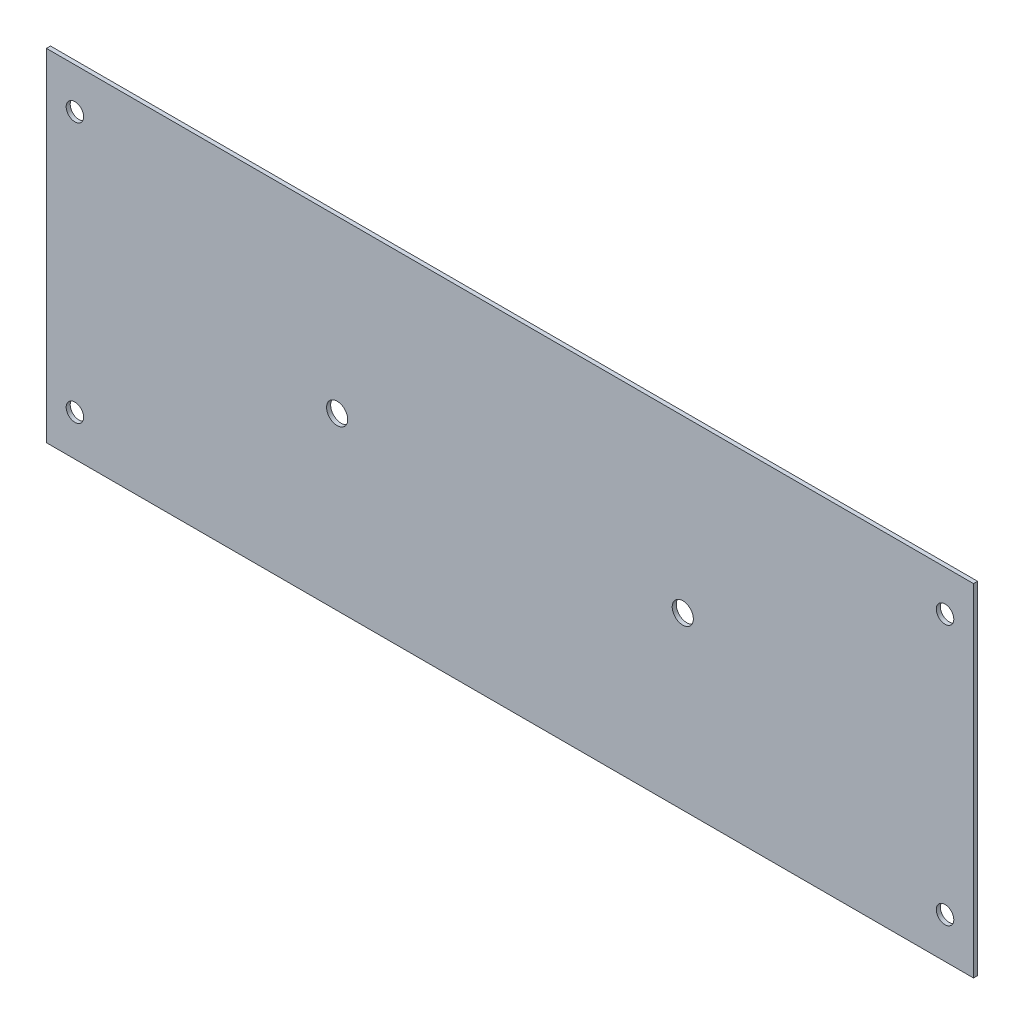
ISO-10303-21;
HEADER;
FILE_DESCRIPTION(('STEP AP214'),'2;1');
FILE_NAME('part.step','',(''),(''),'','','');
FILE_SCHEMA(('AUTOMOTIVE_DESIGN { 1 0 10303 214 1 1 1 1 }'));
ENDSEC;
DATA;
#1=APPLICATION_CONTEXT('core data for automotive mechanical design processes');
#2=APPLICATION_PROTOCOL_DEFINITION('international standard','automotive_design',2000,#1);
#3=PRODUCT_CONTEXT('',#1,'mechanical');
#4=PRODUCT('Part','Part','',(#3));
#5=PRODUCT_RELATED_PRODUCT_CATEGORY('part','',(#4));
#6=PRODUCT_DEFINITION_FORMATION('','',#4);
#7=PRODUCT_DEFINITION_CONTEXT('part definition',#1,'design');
#8=PRODUCT_DEFINITION('design','',#6,#7);
#9=PRODUCT_DEFINITION_SHAPE('','',#8);
#10=(LENGTH_UNIT() NAMED_UNIT(*) SI_UNIT(.MILLI.,.METRE.));
#11=(NAMED_UNIT(*) PLANE_ANGLE_UNIT() SI_UNIT($,.RADIAN.));
#12=(NAMED_UNIT(*) SI_UNIT($,.STERADIAN.) SOLID_ANGLE_UNIT());
#13=UNCERTAINTY_MEASURE_WITH_UNIT(LENGTH_MEASURE(1.E-05),#10,'distance_accuracy_value','');
#14=(GEOMETRIC_REPRESENTATION_CONTEXT(3) GLOBAL_UNCERTAINTY_ASSIGNED_CONTEXT((#13)) GLOBAL_UNIT_ASSIGNED_CONTEXT((#10,
#11,#12)) REPRESENTATION_CONTEXT('',''));
#15=CARTESIAN_POINT('',(0.,0.,0.));
#16=DIRECTION('',(0.,0.,1.));
#17=DIRECTION('',(1.,0.,0.));
#18=AXIS2_PLACEMENT_3D('',#15,#16,#17);
#19=CARTESIAN_POINT('',(-114.,-42.,1.));
#20=DIRECTION('',(0.,0.,-1.));
#21=DIRECTION('',(-1.,0.,0.));
#22=AXIS2_PLACEMENT_3D('',#19,#20,#21);
#23=PLANE('',#22);
#24=CARTESIAN_POINT('',(-107.,-32.,1.));
#25=DIRECTION('',(0.,0.,1.));
#26=DIRECTION('',(1.,0.,0.));
#27=AXIS2_PLACEMENT_3D('',#24,#25,#26);
#28=CIRCLE('',#27,2.15);
#29=CARTESIAN_POINT('',(-104.85,-32.,1.));
#30=VERTEX_POINT('',#29);
#31=EDGE_CURVE('E131',#30,#30,#28,.T.);
#32=ORIENTED_EDGE('',*,*,#31,.F.);
#33=EDGE_LOOP('',(#32));
#34=FACE_BOUND('',#33,.T.);
#35=CARTESIAN_POINT('',(107.,32.,1.));
#36=DIRECTION('',(0.,0.,1.));
#37=DIRECTION('',(1.,0.,0.));
#38=AXIS2_PLACEMENT_3D('',#35,#36,#37);
#39=CIRCLE('',#38,2.15);
#40=CARTESIAN_POINT('',(109.15,32.,1.));
#41=VERTEX_POINT('',#40);
#42=EDGE_CURVE('E119',#41,#41,#39,.T.);
#43=ORIENTED_EDGE('',*,*,#42,.F.);
#44=EDGE_LOOP('',(#43));
#45=FACE_BOUND('',#44,.T.);
#46=CARTESIAN_POINT('',(-42.5,0.,1.));
#47=DIRECTION('',(0.,0.,1.));
#48=DIRECTION('',(1.,0.,0.));
#49=AXIS2_PLACEMENT_3D('',#46,#47,#48);
#50=CIRCLE('',#49,2.6);
#51=CARTESIAN_POINT('',(-39.9,0.,1.));
#52=VERTEX_POINT('',#51);
#53=EDGE_CURVE('E98',#52,#52,#50,.T.);
#54=ORIENTED_EDGE('',*,*,#53,.F.);
#55=EDGE_LOOP('',(#54));
#56=FACE_BOUND('',#55,.T.);
#57=DIRECTION('',(0.,-1.,0.));
#58=VECTOR('',#57,1.);
#59=CARTESIAN_POINT('',(-114.,-42.,1.));
#60=LINE('',#59,#58);
#61=CARTESIAN_POINT('',(-114.,42.,1.));
#62=VERTEX_POINT('',#61);
#63=CARTESIAN_POINT('',(-114.,-42.,1.));
#64=VERTEX_POINT('',#63);
#65=EDGE_CURVE('E83',#62,#64,#60,.T.);
#66=ORIENTED_EDGE('',*,*,#65,.T.);
#67=DIRECTION('',(1.,0.,0.));
#68=VECTOR('',#67,1.);
#69=CARTESIAN_POINT('',(-114.,-42.,1.));
#70=LINE('',#69,#68);
#71=CARTESIAN_POINT('',(114.,-42.,1.));
#72=VERTEX_POINT('',#71);
#73=EDGE_CURVE('E78',#64,#72,#70,.T.);
#74=ORIENTED_EDGE('',*,*,#73,.T.);
#75=DIRECTION('',(0.,1.,0.));
#76=VECTOR('',#75,1.);
#77=CARTESIAN_POINT('',(114.,-42.,1.));
#78=LINE('',#77,#76);
#79=CARTESIAN_POINT('',(114.,42.,1.));
#80=VERTEX_POINT('',#79);
#81=EDGE_CURVE('E81',#72,#80,#78,.T.);
#82=ORIENTED_EDGE('',*,*,#81,.T.);
#83=DIRECTION('',(-1.,0.,0.));
#84=VECTOR('',#83,1.);
#85=CARTESIAN_POINT('',(-114.,42.,1.));
#86=LINE('',#85,#84);
#87=EDGE_CURVE('E48',#80,#62,#86,.T.);
#88=ORIENTED_EDGE('',*,*,#87,.T.);
#89=EDGE_LOOP('',(#66,#74,#82,#88));
#90=FACE_BOUND('',#89,.T.);
#91=CARTESIAN_POINT('',(42.5,0.,1.));
#92=DIRECTION('',(0.,0.,1.));
#93=DIRECTION('',(1.,0.,0.));
#94=AXIS2_PLACEMENT_3D('',#91,#92,#93);
#95=CIRCLE('',#94,2.6);
#96=CARTESIAN_POINT('',(45.1,0.,1.));
#97=VERTEX_POINT('',#96);
#98=EDGE_CURVE('E113',#97,#97,#95,.T.);
#99=ORIENTED_EDGE('',*,*,#98,.F.);
#100=EDGE_LOOP('',(#99));
#101=FACE_BOUND('',#100,.T.);
#102=CARTESIAN_POINT('',(-107.,32.,1.));
#103=DIRECTION('',(0.,0.,1.));
#104=DIRECTION('',(-1.,0.,0.));
#105=AXIS2_PLACEMENT_3D('',#102,#103,#104);
#106=CIRCLE('',#105,2.15);
#107=CARTESIAN_POINT('',(-109.15,32.,1.));
#108=VERTEX_POINT('',#107);
#109=EDGE_CURVE('E125',#108,#108,#106,.T.);
#110=ORIENTED_EDGE('',*,*,#109,.F.);
#111=EDGE_LOOP('',(#110));
#112=FACE_BOUND('',#111,.T.);
#113=CARTESIAN_POINT('',(107.,-32.,1.));
#114=DIRECTION('',(0.,0.,1.));
#115=DIRECTION('',(-1.,0.,0.));
#116=AXIS2_PLACEMENT_3D('',#113,#114,#115);
#117=CIRCLE('',#116,2.15);
#118=CARTESIAN_POINT('',(104.85,-32.,1.));
#119=VERTEX_POINT('',#118);
#120=EDGE_CURVE('E137',#119,#119,#117,.T.);
#121=ORIENTED_EDGE('',*,*,#120,.F.);
#122=EDGE_LOOP('',(#121));
#123=FACE_BOUND('',#122,.T.);
#124=ADVANCED_FACE('F31',(#34,#45,#56,#90,#101,#112,#123),#23,.F.);
#125=CARTESIAN_POINT('',(-114.,-42.,0.));
#126=DIRECTION('',(0.,0.,-1.));
#127=DIRECTION('',(-1.,0.,0.));
#128=AXIS2_PLACEMENT_3D('',#125,#126,#127);
#129=PLANE('',#128);
#130=CARTESIAN_POINT('',(-107.,-32.,0.));
#131=DIRECTION('',(0.,0.,1.));
#132=DIRECTION('',(1.,0.,0.));
#133=AXIS2_PLACEMENT_3D('',#130,#131,#132);
#134=CIRCLE('',#133,2.15);
#135=CARTESIAN_POINT('',(-104.85,-32.,0.));
#136=VERTEX_POINT('',#135);
#137=EDGE_CURVE('E134',#136,#136,#134,.T.);
#138=ORIENTED_EDGE('',*,*,#137,.T.);
#139=EDGE_LOOP('',(#138));
#140=FACE_BOUND('',#139,.T.);
#141=CARTESIAN_POINT('',(107.,32.,0.));
#142=DIRECTION('',(0.,0.,1.));
#143=DIRECTION('',(1.,0.,0.));
#144=AXIS2_PLACEMENT_3D('',#141,#142,#143);
#145=CIRCLE('',#144,2.15);
#146=CARTESIAN_POINT('',(109.15,32.,0.));
#147=VERTEX_POINT('',#146);
#148=EDGE_CURVE('E122',#147,#147,#145,.T.);
#149=ORIENTED_EDGE('',*,*,#148,.T.);
#150=EDGE_LOOP('',(#149));
#151=FACE_BOUND('',#150,.T.);
#152=CARTESIAN_POINT('',(-42.5,0.,0.));
#153=DIRECTION('',(0.,0.,1.));
#154=DIRECTION('',(1.,0.,0.));
#155=AXIS2_PLACEMENT_3D('',#152,#153,#154);
#156=CIRCLE('',#155,2.6);
#157=CARTESIAN_POINT('',(-39.9,0.,0.));
#158=VERTEX_POINT('',#157);
#159=EDGE_CURVE('E110',#158,#158,#156,.T.);
#160=ORIENTED_EDGE('',*,*,#159,.T.);
#161=EDGE_LOOP('',(#160));
#162=FACE_BOUND('',#161,.T.);
#163=DIRECTION('',(0.,-1.,0.));
#164=VECTOR('',#163,1.);
#165=CARTESIAN_POINT('',(-114.,-42.,0.));
#166=LINE('',#165,#164);
#167=CARTESIAN_POINT('',(-114.,42.,0.));
#168=VERTEX_POINT('',#167);
#169=CARTESIAN_POINT('',(-114.,-42.,0.));
#170=VERTEX_POINT('',#169);
#171=EDGE_CURVE('E95',#168,#170,#166,.T.);
#172=ORIENTED_EDGE('',*,*,#171,.F.);
#173=DIRECTION('',(-1.,0.,0.));
#174=VECTOR('',#173,1.);
#175=CARTESIAN_POINT('',(-114.,42.,0.));
#176=LINE('',#175,#174);
#177=CARTESIAN_POINT('',(114.,42.,0.));
#178=VERTEX_POINT('',#177);
#179=EDGE_CURVE('E71',#178,#168,#176,.T.);
#180=ORIENTED_EDGE('',*,*,#179,.F.);
#181=DIRECTION('',(0.,1.,0.));
#182=VECTOR('',#181,1.);
#183=CARTESIAN_POINT('',(114.,-42.,0.));
#184=LINE('',#183,#182);
#185=CARTESIAN_POINT('',(114.,-42.,0.));
#186=VERTEX_POINT('',#185);
#187=EDGE_CURVE('E65',#186,#178,#184,.T.);
#188=ORIENTED_EDGE('',*,*,#187,.F.);
#189=DIRECTION('',(1.,0.,0.));
#190=VECTOR('',#189,1.);
#191=CARTESIAN_POINT('',(-114.,-42.,0.));
#192=LINE('',#191,#190);
#193=EDGE_CURVE('E87',#170,#186,#192,.T.);
#194=ORIENTED_EDGE('',*,*,#193,.F.);
#195=EDGE_LOOP('',(#172,#180,#188,#194));
#196=FACE_BOUND('',#195,.T.);
#197=CARTESIAN_POINT('',(42.5,0.,0.));
#198=DIRECTION('',(0.,0.,1.));
#199=DIRECTION('',(1.,0.,0.));
#200=AXIS2_PLACEMENT_3D('',#197,#198,#199);
#201=CIRCLE('',#200,2.6);
#202=CARTESIAN_POINT('',(45.1,0.,0.));
#203=VERTEX_POINT('',#202);
#204=EDGE_CURVE('E116',#203,#203,#201,.T.);
#205=ORIENTED_EDGE('',*,*,#204,.T.);
#206=EDGE_LOOP('',(#205));
#207=FACE_BOUND('',#206,.T.);
#208=CARTESIAN_POINT('',(-107.,32.,0.));
#209=DIRECTION('',(0.,0.,1.));
#210=DIRECTION('',(-1.,0.,0.));
#211=AXIS2_PLACEMENT_3D('',#208,#209,#210);
#212=CIRCLE('',#211,2.15);
#213=CARTESIAN_POINT('',(-109.15,32.,0.));
#214=VERTEX_POINT('',#213);
#215=EDGE_CURVE('E128',#214,#214,#212,.T.);
#216=ORIENTED_EDGE('',*,*,#215,.T.);
#217=EDGE_LOOP('',(#216));
#218=FACE_BOUND('',#217,.T.);
#219=CARTESIAN_POINT('',(107.,-32.,0.));
#220=DIRECTION('',(0.,0.,1.));
#221=DIRECTION('',(-1.,0.,0.));
#222=AXIS2_PLACEMENT_3D('',#219,#220,#221);
#223=CIRCLE('',#222,2.15);
#224=CARTESIAN_POINT('',(104.85,-32.,0.));
#225=VERTEX_POINT('',#224);
#226=EDGE_CURVE('E140',#225,#225,#223,.T.);
#227=ORIENTED_EDGE('',*,*,#226,.T.);
#228=EDGE_LOOP('',(#227));
#229=FACE_BOUND('',#228,.T.);
#230=ADVANCED_FACE('F106',(#140,#151,#162,#196,#207,#218,#229),#129,.T.);
#231=CARTESIAN_POINT('',(-114.,-42.,1.));
#232=DIRECTION('',(1.,0.,0.));
#233=DIRECTION('',(0.,0.,-1.));
#234=AXIS2_PLACEMENT_3D('',#231,#232,#233);
#235=PLANE('',#234);
#236=ORIENTED_EDGE('',*,*,#171,.T.);
#237=DIRECTION('',(0.,0.,-1.));
#238=VECTOR('',#237,1.);
#239=CARTESIAN_POINT('',(-114.,-42.,1.));
#240=LINE('',#239,#238);
#241=EDGE_CURVE('E11',#64,#170,#240,.T.);
#242=ORIENTED_EDGE('',*,*,#241,.F.);
#243=ORIENTED_EDGE('',*,*,#65,.F.);
#244=DIRECTION('',(0.,0.,-1.));
#245=VECTOR('',#244,1.);
#246=CARTESIAN_POINT('',(-114.,42.,1.));
#247=LINE('',#246,#245);
#248=EDGE_CURVE('E91',#62,#168,#247,.T.);
#249=ORIENTED_EDGE('',*,*,#248,.T.);
#250=EDGE_LOOP('',(#236,#242,#243,#249));
#251=FACE_BOUND('',#250,.T.);
#252=ADVANCED_FACE('F33',(#251),#235,.F.);
#253=CARTESIAN_POINT('',(-114.,-42.,1.));
#254=DIRECTION('',(0.,1.,0.));
#255=DIRECTION('',(0.,0.,1.));
#256=AXIS2_PLACEMENT_3D('',#253,#254,#255);
#257=PLANE('',#256);
#258=ORIENTED_EDGE('',*,*,#193,.T.);
#259=DIRECTION('',(0.,0.,-1.));
#260=VECTOR('',#259,1.);
#261=CARTESIAN_POINT('',(114.,-42.,1.));
#262=LINE('',#261,#260);
#263=EDGE_CURVE('E40',#72,#186,#262,.T.);
#264=ORIENTED_EDGE('',*,*,#263,.F.);
#265=ORIENTED_EDGE('',*,*,#73,.F.);
#266=ORIENTED_EDGE('',*,*,#241,.T.);
#267=EDGE_LOOP('',(#258,#264,#265,#266));
#268=FACE_BOUND('',#267,.T.);
#269=ADVANCED_FACE('F86',(#268),#257,.F.);
#270=CARTESIAN_POINT('',(114.,-42.,1.));
#271=DIRECTION('',(-1.,0.,0.));
#272=DIRECTION('',(0.,0.,1.));
#273=AXIS2_PLACEMENT_3D('',#270,#271,#272);
#274=PLANE('',#273);
#275=ORIENTED_EDGE('',*,*,#187,.T.);
#276=DIRECTION('',(0.,0.,-1.));
#277=VECTOR('',#276,1.);
#278=CARTESIAN_POINT('',(114.,42.,1.));
#279=LINE('',#278,#277);
#280=EDGE_CURVE('E88',#80,#178,#279,.T.);
#281=ORIENTED_EDGE('',*,*,#280,.F.);
#282=ORIENTED_EDGE('',*,*,#81,.F.);
#283=ORIENTED_EDGE('',*,*,#263,.T.);
#284=EDGE_LOOP('',(#275,#281,#282,#283));
#285=FACE_BOUND('',#284,.T.);
#286=ADVANCED_FACE('F89',(#285),#274,.F.);
#287=CARTESIAN_POINT('',(-114.,42.,1.));
#288=DIRECTION('',(0.,-1.,0.));
#289=DIRECTION('',(1.,0.,0.));
#290=AXIS2_PLACEMENT_3D('',#287,#288,#289);
#291=PLANE('',#290);
#292=ORIENTED_EDGE('',*,*,#179,.T.);
#293=ORIENTED_EDGE('',*,*,#248,.F.);
#294=ORIENTED_EDGE('',*,*,#87,.F.);
#295=ORIENTED_EDGE('',*,*,#280,.T.);
#296=EDGE_LOOP('',(#292,#293,#294,#295));
#297=FACE_BOUND('',#296,.T.);
#298=ADVANCED_FACE('F103',(#297),#291,.F.);
#299=CARTESIAN_POINT('',(-42.5,0.,1.));
#300=DIRECTION('',(0.,0.,-1.));
#301=DIRECTION('',(-1.,0.,0.));
#302=AXIS2_PLACEMENT_3D('',#299,#300,#301);
#303=CYLINDRICAL_SURFACE('',#302,2.6);
#304=ORIENTED_EDGE('',*,*,#53,.T.);
#305=EDGE_LOOP('',(#304));
#306=FACE_BOUND('',#305,.T.);
#307=ORIENTED_EDGE('',*,*,#159,.F.);
#308=EDGE_LOOP('',(#307));
#309=FACE_BOUND('',#308,.T.);
#310=ADVANCED_FACE('F160',(#306,#309),#303,.F.);
#311=CARTESIAN_POINT('',(42.5,0.,1.));
#312=DIRECTION('',(0.,0.,-1.));
#313=DIRECTION('',(-1.,0.,0.));
#314=AXIS2_PLACEMENT_3D('',#311,#312,#313);
#315=CYLINDRICAL_SURFACE('',#314,2.6);
#316=ORIENTED_EDGE('',*,*,#98,.T.);
#317=EDGE_LOOP('',(#316));
#318=FACE_BOUND('',#317,.T.);
#319=ORIENTED_EDGE('',*,*,#204,.F.);
#320=EDGE_LOOP('',(#319));
#321=FACE_BOUND('',#320,.T.);
#322=ADVANCED_FACE('F206',(#318,#321),#315,.F.);
#323=CARTESIAN_POINT('',(107.,32.,1.));
#324=DIRECTION('',(0.,0.,-1.));
#325=DIRECTION('',(-1.,0.,0.));
#326=AXIS2_PLACEMENT_3D('',#323,#324,#325);
#327=CYLINDRICAL_SURFACE('',#326,2.15);
#328=ORIENTED_EDGE('',*,*,#42,.T.);
#329=EDGE_LOOP('',(#328));
#330=FACE_BOUND('',#329,.T.);
#331=ORIENTED_EDGE('',*,*,#148,.F.);
#332=EDGE_LOOP('',(#331));
#333=FACE_BOUND('',#332,.T.);
#334=ADVANCED_FACE('F214',(#330,#333),#327,.F.);
#335=CARTESIAN_POINT('',(-107.,32.,1.));
#336=DIRECTION('',(0.,0.,-1.));
#337=DIRECTION('',(-1.,0.,0.));
#338=AXIS2_PLACEMENT_3D('',#335,#336,#337);
#339=CYLINDRICAL_SURFACE('',#338,2.15);
#340=ORIENTED_EDGE('',*,*,#109,.T.);
#341=EDGE_LOOP('',(#340));
#342=FACE_BOUND('',#341,.T.);
#343=ORIENTED_EDGE('',*,*,#215,.F.);
#344=EDGE_LOOP('',(#343));
#345=FACE_BOUND('',#344,.T.);
#346=ADVANCED_FACE('F222',(#342,#345),#339,.F.);
#347=CARTESIAN_POINT('',(-107.,-32.,1.));
#348=DIRECTION('',(0.,0.,-1.));
#349=DIRECTION('',(-1.,0.,0.));
#350=AXIS2_PLACEMENT_3D('',#347,#348,#349);
#351=CYLINDRICAL_SURFACE('',#350,2.15);
#352=ORIENTED_EDGE('',*,*,#31,.T.);
#353=EDGE_LOOP('',(#352));
#354=FACE_BOUND('',#353,.T.);
#355=ORIENTED_EDGE('',*,*,#137,.F.);
#356=EDGE_LOOP('',(#355));
#357=FACE_BOUND('',#356,.T.);
#358=ADVANCED_FACE('F231',(#354,#357),#351,.F.);
#359=CARTESIAN_POINT('',(107.,-32.,1.));
#360=DIRECTION('',(0.,0.,-1.));
#361=DIRECTION('',(-1.,0.,0.));
#362=AXIS2_PLACEMENT_3D('',#359,#360,#361);
#363=CYLINDRICAL_SURFACE('',#362,2.15);
#364=ORIENTED_EDGE('',*,*,#120,.T.);
#365=EDGE_LOOP('',(#364));
#366=FACE_BOUND('',#365,.T.);
#367=ORIENTED_EDGE('',*,*,#226,.F.);
#368=EDGE_LOOP('',(#367));
#369=FACE_BOUND('',#368,.T.);
#370=ADVANCED_FACE('F146',(#366,#369),#363,.F.);
#371=CLOSED_SHELL('',(#124,#230,#252,#269,#286,#298,#310,#322,#334,#346,#358,#370));
#372=MANIFOLD_SOLID_BREP('B2',#371);
#373=ADVANCED_BREP_SHAPE_REPRESENTATION('',(#18,#372),#14);
#374=SHAPE_DEFINITION_REPRESENTATION(#9,#373);
ENDSEC;
END-ISO-10303-21;
